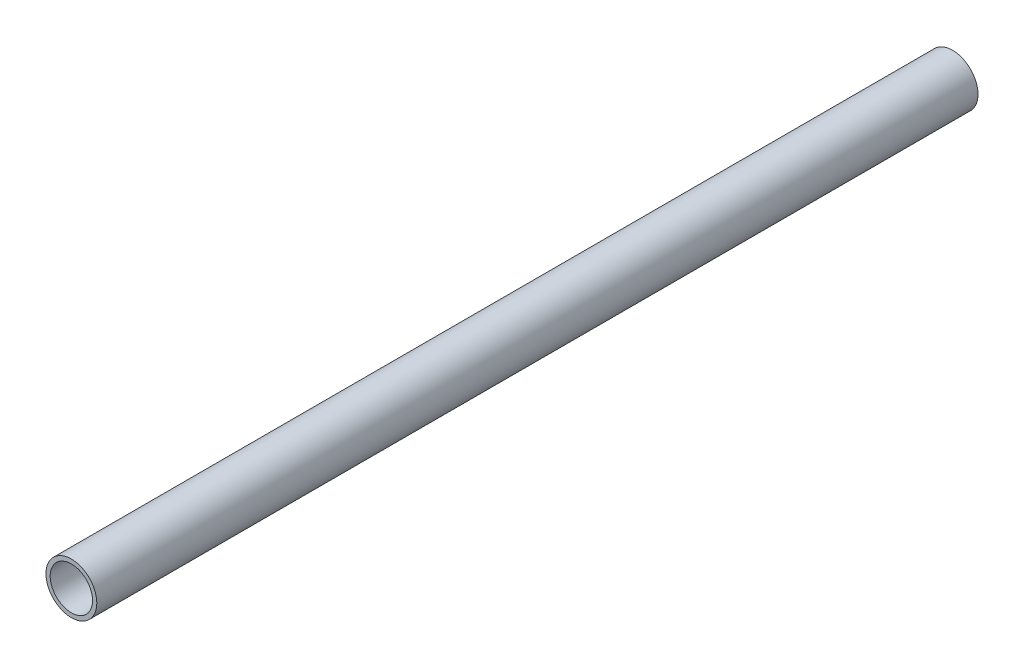
ISO-10303-21;
HEADER;
FILE_DESCRIPTION(('STEP AP214'),'2;1');
FILE_NAME('part.step','',(''),(''),'','','');
FILE_SCHEMA(('AUTOMOTIVE_DESIGN { 1 0 10303 214 1 1 1 1 }'));
ENDSEC;
DATA;
#1=APPLICATION_CONTEXT('core data for automotive mechanical design processes');
#2=APPLICATION_PROTOCOL_DEFINITION('international standard','automotive_design',2000,#1);
#3=PRODUCT_CONTEXT('',#1,'mechanical');
#4=PRODUCT('Part','Part','',(#3));
#5=PRODUCT_RELATED_PRODUCT_CATEGORY('part','',(#4));
#6=PRODUCT_DEFINITION_FORMATION('','',#4);
#7=PRODUCT_DEFINITION_CONTEXT('part definition',#1,'design');
#8=PRODUCT_DEFINITION('design','',#6,#7);
#9=PRODUCT_DEFINITION_SHAPE('','',#8);
#10=(LENGTH_UNIT() NAMED_UNIT(*) SI_UNIT(.MILLI.,.METRE.));
#11=(NAMED_UNIT(*) PLANE_ANGLE_UNIT() SI_UNIT($,.RADIAN.));
#12=(NAMED_UNIT(*) SI_UNIT($,.STERADIAN.) SOLID_ANGLE_UNIT());
#13=UNCERTAINTY_MEASURE_WITH_UNIT(LENGTH_MEASURE(1.E-05),#10,'distance_accuracy_value','');
#14=(GEOMETRIC_REPRESENTATION_CONTEXT(3) GLOBAL_UNCERTAINTY_ASSIGNED_CONTEXT((#13)) GLOBAL_UNIT_ASSIGNED_CONTEXT((#10,
#11,#12)) REPRESENTATION_CONTEXT('',''));
#15=CARTESIAN_POINT('',(0.,0.,0.));
#16=DIRECTION('',(0.,0.,1.));
#17=DIRECTION('',(1.,0.,0.));
#18=AXIS2_PLACEMENT_3D('',#15,#16,#17);
#19=CARTESIAN_POINT('',(0.,0.,660.4));
#20=DIRECTION('',(0.,0.,1.));
#21=DIRECTION('',(1.,0.,0.));
#22=AXIS2_PLACEMENT_3D('',#19,#20,#21);
#23=PLANE('',#22);
#24=CARTESIAN_POINT('',(0.,0.,660.4));
#25=DIRECTION('',(0.,0.,1.));
#26=DIRECTION('',(1.,0.,0.));
#27=AXIS2_PLACEMENT_3D('',#24,#25,#26);
#28=CIRCLE('',#27,38.1);
#29=CARTESIAN_POINT('',(38.1,0.,660.4));
#30=VERTEX_POINT('',#29);
#31=EDGE_CURVE('E10',#30,#30,#28,.T.);
#32=ORIENTED_EDGE('',*,*,#31,.T.);
#33=EDGE_LOOP('',(#32));
#34=FACE_BOUND('',#33,.T.);
#35=CARTESIAN_POINT('',(0.,0.,660.4));
#36=DIRECTION('',(0.,0.,1.));
#37=DIRECTION('',(1.,0.,0.));
#38=AXIS2_PLACEMENT_3D('',#35,#36,#37);
#39=CIRCLE('',#38,31.75);
#40=CARTESIAN_POINT('',(31.75,0.,660.4));
#41=VERTEX_POINT('',#40);
#42=EDGE_CURVE('E44',#41,#41,#39,.T.);
#43=ORIENTED_EDGE('',*,*,#42,.F.);
#44=EDGE_LOOP('',(#43));
#45=FACE_BOUND('',#44,.T.);
#46=ADVANCED_FACE('F33',(#34,#45),#23,.T.);
#47=CARTESIAN_POINT('',(0.,0.,-660.4));
#48=DIRECTION('',(0.,0.,1.));
#49=DIRECTION('',(1.,0.,0.));
#50=AXIS2_PLACEMENT_3D('',#47,#48,#49);
#51=PLANE('',#50);
#52=CARTESIAN_POINT('',(0.,0.,-660.4));
#53=DIRECTION('',(0.,0.,1.));
#54=DIRECTION('',(1.,0.,0.));
#55=AXIS2_PLACEMENT_3D('',#52,#53,#54);
#56=CIRCLE('',#55,38.1);
#57=CARTESIAN_POINT('',(38.1,0.,-660.4));
#58=VERTEX_POINT('',#57);
#59=EDGE_CURVE('E37',#58,#58,#56,.T.);
#60=ORIENTED_EDGE('',*,*,#59,.F.);
#61=EDGE_LOOP('',(#60));
#62=FACE_BOUND('',#61,.T.);
#63=CARTESIAN_POINT('',(0.,0.,-660.4));
#64=DIRECTION('',(0.,0.,1.));
#65=DIRECTION('',(1.,0.,0.));
#66=AXIS2_PLACEMENT_3D('',#63,#64,#65);
#67=CIRCLE('',#66,31.75);
#68=CARTESIAN_POINT('',(31.75,0.,-660.4));
#69=VERTEX_POINT('',#68);
#70=EDGE_CURVE('E46',#69,#69,#67,.T.);
#71=ORIENTED_EDGE('',*,*,#70,.T.);
#72=EDGE_LOOP('',(#71));
#73=FACE_BOUND('',#72,.T.);
#74=ADVANCED_FACE('F56',(#62,#73),#51,.F.);
#75=CARTESIAN_POINT('',(0.,0.,660.4));
#76=DIRECTION('',(0.,0.,-1.));
#77=DIRECTION('',(-1.,0.,0.));
#78=AXIS2_PLACEMENT_3D('',#75,#76,#77);
#79=CYLINDRICAL_SURFACE('',#78,38.1);
#80=ORIENTED_EDGE('',*,*,#31,.F.);
#81=EDGE_LOOP('',(#80));
#82=FACE_BOUND('',#81,.T.);
#83=ORIENTED_EDGE('',*,*,#59,.T.);
#84=EDGE_LOOP('',(#83));
#85=FACE_BOUND('',#84,.T.);
#86=ADVANCED_FACE('F35',(#82,#85),#79,.T.);
#87=CARTESIAN_POINT('',(0.,0.,660.4));
#88=DIRECTION('',(0.,0.,-1.));
#89=DIRECTION('',(-1.,0.,0.));
#90=AXIS2_PLACEMENT_3D('',#87,#88,#89);
#91=CYLINDRICAL_SURFACE('',#90,31.75);
#92=ORIENTED_EDGE('',*,*,#42,.T.);
#93=EDGE_LOOP('',(#92));
#94=FACE_BOUND('',#93,.T.);
#95=ORIENTED_EDGE('',*,*,#70,.F.);
#96=EDGE_LOOP('',(#95));
#97=FACE_BOUND('',#96,.T.);
#98=ADVANCED_FACE('F52',(#94,#97),#91,.F.);
#99=CLOSED_SHELL('',(#46,#74,#86,#98));
#100=MANIFOLD_SOLID_BREP('B2',#99);
#101=ADVANCED_BREP_SHAPE_REPRESENTATION('',(#18,#100),#14);
#102=SHAPE_DEFINITION_REPRESENTATION(#9,#101);
ENDSEC;
END-ISO-10303-21;
